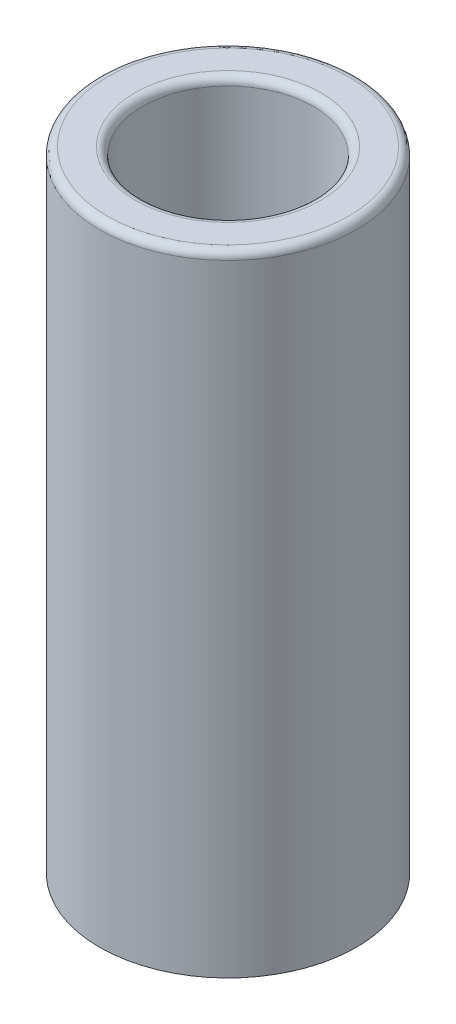
ISO-10303-21;
HEADER;
FILE_DESCRIPTION(('STEP AP214'),'2;1');
FILE_NAME('part.step','',(''),(''),'','','');
FILE_SCHEMA(('AUTOMOTIVE_DESIGN { 1 0 10303 214 1 1 1 1 }'));
ENDSEC;
DATA;
#1=APPLICATION_CONTEXT('core data for automotive mechanical design processes');
#2=APPLICATION_PROTOCOL_DEFINITION('international standard','automotive_design',2000,#1);
#3=PRODUCT_CONTEXT('',#1,'mechanical');
#4=PRODUCT('Part','Part','',(#3));
#5=PRODUCT_RELATED_PRODUCT_CATEGORY('part','',(#4));
#6=PRODUCT_DEFINITION_FORMATION('','',#4);
#7=PRODUCT_DEFINITION_CONTEXT('part definition',#1,'design');
#8=PRODUCT_DEFINITION('design','',#6,#7);
#9=PRODUCT_DEFINITION_SHAPE('','',#8);
#10=(LENGTH_UNIT() NAMED_UNIT(*) SI_UNIT(.MILLI.,.METRE.));
#11=(NAMED_UNIT(*) PLANE_ANGLE_UNIT() SI_UNIT($,.RADIAN.));
#12=(NAMED_UNIT(*) SI_UNIT($,.STERADIAN.) SOLID_ANGLE_UNIT());
#13=UNCERTAINTY_MEASURE_WITH_UNIT(LENGTH_MEASURE(1.E-05),#10,'distance_accuracy_value','');
#14=(GEOMETRIC_REPRESENTATION_CONTEXT(3) GLOBAL_UNCERTAINTY_ASSIGNED_CONTEXT((#13)) GLOBAL_UNIT_ASSIGNED_CONTEXT((#10,
#11,#12)) REPRESENTATION_CONTEXT('',''));
#15=CARTESIAN_POINT('',(0.,0.,0.));
#16=DIRECTION('',(0.,0.,1.));
#17=DIRECTION('',(1.,0.,0.));
#18=AXIS2_PLACEMENT_3D('',#15,#16,#17);
#19=CARTESIAN_POINT('',(0.,12.,0.));
#20=DIRECTION('',(0.,1.,0.));
#21=DIRECTION('',(0.,0.,1.));
#22=AXIS2_PLACEMENT_3D('',#19,#20,#21);
#23=PLANE('',#22);
#24=CARTESIAN_POINT('',(0.,12.,0.));
#25=DIRECTION('',(0.,1.,0.));
#26=DIRECTION('',(0.,0.,1.));
#27=AXIS2_PLACEMENT_3D('',#24,#25,#26);
#28=CIRCLE('',#27,1.775);
#29=CARTESIAN_POINT('',(0.,12.,1.775));
#30=VERTEX_POINT('',#29);
#31=EDGE_CURVE('E53',#30,#30,#28,.F.);
#32=ORIENTED_EDGE('',*,*,#31,.T.);
#33=EDGE_LOOP('',(#32));
#34=FACE_BOUND('',#33,.T.);
#35=CARTESIAN_POINT('',(0.,12.,0.));
#36=DIRECTION('',(0.,1.,0.));
#37=DIRECTION('',(0.,0.,1.));
#38=AXIS2_PLACEMENT_3D('',#35,#36,#37);
#39=CIRCLE('',#38,2.3);
#40=CARTESIAN_POINT('',(0.,12.,2.3));
#41=VERTEX_POINT('',#40);
#42=EDGE_CURVE('E58',#41,#41,#39,.T.);
#43=ORIENTED_EDGE('',*,*,#42,.T.);
#44=EDGE_LOOP('',(#43));
#45=FACE_BOUND('',#44,.T.);
#46=ADVANCED_FACE('F45',(#34,#45),#23,.T.);
#47=CARTESIAN_POINT('',(0.,0.,0.));
#48=DIRECTION('',(0.,1.,0.));
#49=DIRECTION('',(0.,0.,1.));
#50=AXIS2_PLACEMENT_3D('',#47,#48,#49);
#51=PLANE('',#50);
#52=CARTESIAN_POINT('',(0.,0.,0.));
#53=DIRECTION('',(0.,1.,0.));
#54=DIRECTION('',(0.,0.,1.));
#55=AXIS2_PLACEMENT_3D('',#52,#53,#54);
#56=CIRCLE('',#55,2.45);
#57=CARTESIAN_POINT('',(0.,0.,2.45));
#58=VERTEX_POINT('',#57);
#59=EDGE_CURVE('E73',#58,#58,#56,.T.);
#60=ORIENTED_EDGE('',*,*,#59,.F.);
#61=EDGE_LOOP('',(#60));
#62=FACE_BOUND('',#61,.T.);
#63=ADVANCED_FACE('F80',(#62),#51,.F.);
#64=CARTESIAN_POINT('',(0.,12.,0.));
#65=DIRECTION('',(0.,-1.,0.));
#66=DIRECTION('',(0.,0.,-1.));
#67=AXIS2_PLACEMENT_3D('',#64,#65,#66);
#68=CYLINDRICAL_SURFACE('',#67,2.45);
#69=CARTESIAN_POINT('',(0.,11.85,0.));
#70=DIRECTION('',(0.,1.,0.));
#71=DIRECTION('',(0.,0.,1.));
#72=AXIS2_PLACEMENT_3D('',#69,#70,#71);
#73=CIRCLE('',#72,2.45);
#74=CARTESIAN_POINT('',(0.,11.85,2.45));
#75=VERTEX_POINT('',#74);
#76=EDGE_CURVE('E11',#75,#75,#73,.F.);
#77=ORIENTED_EDGE('',*,*,#76,.T.);
#78=EDGE_LOOP('',(#77));
#79=FACE_BOUND('',#78,.T.);
#80=ORIENTED_EDGE('',*,*,#59,.T.);
#81=EDGE_LOOP('',(#80));
#82=FACE_BOUND('',#81,.T.);
#83=ADVANCED_FACE('F78',(#79,#82),#68,.T.);
#84=CARTESIAN_POINT('',(0.,12.,0.));
#85=DIRECTION('',(0.,-1.,0.));
#86=DIRECTION('',(0.,0.,-1.));
#87=AXIS2_PLACEMENT_3D('',#84,#85,#86);
#88=CYLINDRICAL_SURFACE('',#87,1.625);
#89=CARTESIAN_POINT('',(0.,11.85,0.));
#90=DIRECTION('',(0.,1.,0.));
#91=DIRECTION('',(0.,0.,1.));
#92=AXIS2_PLACEMENT_3D('',#89,#90,#91);
#93=CIRCLE('',#92,1.625);
#94=CARTESIAN_POINT('',(0.,11.85,1.625));
#95=VERTEX_POINT('',#94);
#96=EDGE_CURVE('E63',#95,#95,#93,.T.);
#97=ORIENTED_EDGE('',*,*,#96,.T.);
#98=EDGE_LOOP('',(#97));
#99=FACE_BOUND('',#98,.T.);
#100=CARTESIAN_POINT('',(0.,3.,0.));
#101=DIRECTION('',(0.,1.,0.));
#102=DIRECTION('',(0.,0.,1.));
#103=AXIS2_PLACEMENT_3D('',#100,#101,#102);
#104=CIRCLE('',#103,1.625);
#105=CARTESIAN_POINT('',(0.,3.,1.625));
#106=VERTEX_POINT('',#105);
#107=EDGE_CURVE('E69',#106,#106,#104,.T.);
#108=ORIENTED_EDGE('',*,*,#107,.F.);
#109=EDGE_LOOP('',(#108));
#110=FACE_BOUND('',#109,.T.);
#111=ADVANCED_FACE('F87',(#99,#110),#88,.F.);
#112=CARTESIAN_POINT('',(0.,3.,0.));
#113=DIRECTION('',(0.,1.,0.));
#114=DIRECTION('',(0.,0.,1.));
#115=AXIS2_PLACEMENT_3D('',#112,#113,#114);
#116=PLANE('',#115);
#117=ORIENTED_EDGE('',*,*,#107,.T.);
#118=EDGE_LOOP('',(#117));
#119=FACE_BOUND('',#118,.T.);
#120=ADVANCED_FACE('F94',(#119),#116,.T.);
#121=CARTESIAN_POINT('',(0.,11.85,0.));
#122=DIRECTION('',(0.,1.,0.));
#123=DIRECTION('',(0.,0.,1.));
#124=AXIS2_PLACEMENT_3D('',#121,#122,#123);
#125=TOROIDAL_SURFACE('',#124,1.775,0.15);
#126=ORIENTED_EDGE('',*,*,#31,.F.);
#127=EDGE_LOOP('',(#126));
#128=FACE_BOUND('',#127,.T.);
#129=ORIENTED_EDGE('',*,*,#96,.F.);
#130=EDGE_LOOP('',(#129));
#131=FACE_BOUND('',#130,.T.);
#132=ADVANCED_FACE('F92',(#128,#131),#125,.T.);
#133=CARTESIAN_POINT('',(0.,11.85,0.));
#134=DIRECTION('',(0.,1.,0.));
#135=DIRECTION('',(0.,0.,1.));
#136=AXIS2_PLACEMENT_3D('',#133,#134,#135);
#137=TOROIDAL_SURFACE('',#136,2.3,0.15);
#138=ORIENTED_EDGE('',*,*,#76,.F.);
#139=EDGE_LOOP('',(#138));
#140=FACE_BOUND('',#139,.T.);
#141=ORIENTED_EDGE('',*,*,#42,.F.);
#142=EDGE_LOOP('',(#141));
#143=FACE_BOUND('',#142,.T.);
#144=ADVANCED_FACE('F47',(#140,#143),#137,.T.);
#145=CLOSED_SHELL('',(#46,#63,#83,#111,#120,#132,#144));
#146=MANIFOLD_SOLID_BREP('B2',#145);
#147=ADVANCED_BREP_SHAPE_REPRESENTATION('',(#18,#146),#14);
#148=SHAPE_DEFINITION_REPRESENTATION(#9,#147);
ENDSEC;
END-ISO-10303-21;
